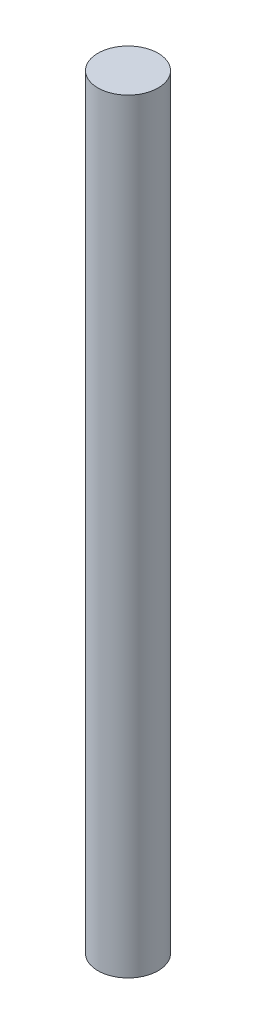
ISO-10303-21;
HEADER;
FILE_DESCRIPTION(('STEP AP214'),'2;1');
FILE_NAME('part.step','',(''),(''),'','','');
FILE_SCHEMA(('AUTOMOTIVE_DESIGN { 1 0 10303 214 1 1 1 1 }'));
ENDSEC;
DATA;
#1=APPLICATION_CONTEXT('core data for automotive mechanical design processes');
#2=APPLICATION_PROTOCOL_DEFINITION('international standard','automotive_design',2000,#1);
#3=PRODUCT_CONTEXT('',#1,'mechanical');
#4=PRODUCT('Part','Part','',(#3));
#5=PRODUCT_RELATED_PRODUCT_CATEGORY('part','',(#4));
#6=PRODUCT_DEFINITION_FORMATION('','',#4);
#7=PRODUCT_DEFINITION_CONTEXT('part definition',#1,'design');
#8=PRODUCT_DEFINITION('design','',#6,#7);
#9=PRODUCT_DEFINITION_SHAPE('','',#8);
#10=(LENGTH_UNIT() NAMED_UNIT(*) SI_UNIT(.MILLI.,.METRE.));
#11=(NAMED_UNIT(*) PLANE_ANGLE_UNIT() SI_UNIT($,.RADIAN.));
#12=(NAMED_UNIT(*) SI_UNIT($,.STERADIAN.) SOLID_ANGLE_UNIT());
#13=UNCERTAINTY_MEASURE_WITH_UNIT(LENGTH_MEASURE(1.E-05),#10,'distance_accuracy_value','');
#14=(GEOMETRIC_REPRESENTATION_CONTEXT(3) GLOBAL_UNCERTAINTY_ASSIGNED_CONTEXT((#13)) GLOBAL_UNIT_ASSIGNED_CONTEXT((#10,
#11,#12)) REPRESENTATION_CONTEXT('',''));
#15=CARTESIAN_POINT('',(0.,0.,0.));
#16=DIRECTION('',(0.,0.,1.));
#17=DIRECTION('',(1.,0.,0.));
#18=AXIS2_PLACEMENT_3D('',#15,#16,#17);
#19=CARTESIAN_POINT('',(0.,50.8,0.));
#20=DIRECTION('',(0.,-1.,0.));
#21=DIRECTION('',(0.,0.,-1.));
#22=AXIS2_PLACEMENT_3D('',#19,#20,#21);
#23=CYLINDRICAL_SURFACE('',#22,1.999996);
#24=CARTESIAN_POINT('',(0.,50.8,0.));
#25=DIRECTION('',(0.,1.,0.));
#26=DIRECTION('',(0.,0.,1.));
#27=AXIS2_PLACEMENT_3D('',#24,#25,#26);
#28=CIRCLE('',#27,1.999996);
#29=CARTESIAN_POINT('',(0.,50.8,-1.999996));
#30=VERTEX_POINT('',#29);
#31=EDGE_CURVE('E10',#30,#30,#28,.T.);
#32=CARTESIAN_POINT('',(0.,0.,0.));
#33=DIRECTION('',(0.,1.,0.));
#34=DIRECTION('',(0.,0.,1.));
#35=AXIS2_PLACEMENT_3D('',#32,#33,#34);
#36=CIRCLE('',#35,1.999996);
#37=CARTESIAN_POINT('',(0.,0.,-1.999996));
#38=VERTEX_POINT('',#37);
#39=EDGE_CURVE('E34',#38,#38,#36,.T.);
#40=CARTESIAN_POINT('',(0.,50.8,-1.999996));
#41=CARTESIAN_POINT('',(0.,50.2708333333333,-1.999996));
#42=CARTESIAN_POINT('',(0.,49.7416666666667,-1.999996));
#43=CARTESIAN_POINT('',(0.,48.6833333333333,-1.999996));
#44=CARTESIAN_POINT('',(0.,48.1541666666667,-1.999996));
#45=CARTESIAN_POINT('',(0.,47.0958333333333,-1.999996));
#46=CARTESIAN_POINT('',(0.,46.5666666666667,-1.999996));
#47=CARTESIAN_POINT('',(0.,45.5083333333333,-1.999996));
#48=CARTESIAN_POINT('',(0.,44.9791666666667,-1.999996));
#49=CARTESIAN_POINT('',(0.,43.9208333333333,-1.999996));
#50=CARTESIAN_POINT('',(0.,43.3916666666667,-1.999996));
#51=CARTESIAN_POINT('',(0.,42.3333333333333,-1.999996));
#52=CARTESIAN_POINT('',(0.,41.8041666666667,-1.999996));
#53=CARTESIAN_POINT('',(0.,40.7458333333333,-1.999996));
#54=CARTESIAN_POINT('',(0.,40.2166666666667,-1.999996));
#55=CARTESIAN_POINT('',(0.,39.1583333333333,-1.999996));
#56=CARTESIAN_POINT('',(0.,38.6291666666667,-1.999996));
#57=CARTESIAN_POINT('',(0.,37.5708333333333,-1.999996));
#58=CARTESIAN_POINT('',(0.,37.0416666666667,-1.999996));
#59=CARTESIAN_POINT('',(0.,35.9833333333333,-1.999996));
#60=CARTESIAN_POINT('',(0.,35.4541666666667,-1.999996));
#61=CARTESIAN_POINT('',(0.,34.3958333333333,-1.999996));
#62=CARTESIAN_POINT('',(0.,33.8666666666667,-1.999996));
#63=CARTESIAN_POINT('',(0.,32.8083333333333,-1.999996));
#64=CARTESIAN_POINT('',(0.,32.2791666666667,-1.999996));
#65=CARTESIAN_POINT('',(0.,31.2208333333333,-1.999996));
#66=CARTESIAN_POINT('',(0.,30.6916666666667,-1.999996));
#67=CARTESIAN_POINT('',(0.,29.6333333333333,-1.999996));
#68=CARTESIAN_POINT('',(0.,29.1041666666667,-1.999996));
#69=CARTESIAN_POINT('',(0.,28.0458333333333,-1.999996));
#70=CARTESIAN_POINT('',(0.,27.5166666666667,-1.999996));
#71=CARTESIAN_POINT('',(0.,26.4583333333333,-1.999996));
#72=CARTESIAN_POINT('',(0.,25.9291666666667,-1.999996));
#73=CARTESIAN_POINT('',(0.,24.8708333333333,-1.999996));
#74=CARTESIAN_POINT('',(0.,24.3416666666667,-1.999996));
#75=CARTESIAN_POINT('',(0.,23.2833333333333,-1.999996));
#76=CARTESIAN_POINT('',(0.,22.7541666666667,-1.999996));
#77=CARTESIAN_POINT('',(0.,21.6958333333333,-1.999996));
#78=CARTESIAN_POINT('',(0.,21.1666666666667,-1.999996));
#79=CARTESIAN_POINT('',(0.,20.1083333333333,-1.999996));
#80=CARTESIAN_POINT('',(0.,19.5791666666667,-1.999996));
#81=CARTESIAN_POINT('',(0.,18.5208333333333,-1.999996));
#82=CARTESIAN_POINT('',(0.,17.9916666666667,-1.999996));
#83=CARTESIAN_POINT('',(0.,16.9333333333333,-1.999996));
#84=CARTESIAN_POINT('',(0.,16.4041666666667,-1.999996));
#85=CARTESIAN_POINT('',(0.,15.3458333333333,-1.999996));
#86=CARTESIAN_POINT('',(0.,14.8166666666667,-1.999996));
#87=CARTESIAN_POINT('',(0.,13.7583333333333,-1.999996));
#88=CARTESIAN_POINT('',(0.,13.2291666666667,-1.999996));
#89=CARTESIAN_POINT('',(0.,12.1708333333333,-1.999996));
#90=CARTESIAN_POINT('',(0.,11.6416666666667,-1.999996));
#91=CARTESIAN_POINT('',(0.,10.5833333333333,-1.999996));
#92=CARTESIAN_POINT('',(0.,10.0541666666667,-1.999996));
#93=CARTESIAN_POINT('',(0.,8.99583333333333,-1.999996));
#94=CARTESIAN_POINT('',(0.,8.46666666666667,-1.999996));
#95=CARTESIAN_POINT('',(0.,7.40833333333333,-1.999996));
#96=CARTESIAN_POINT('',(0.,6.87916666666667,-1.999996));
#97=CARTESIAN_POINT('',(0.,5.82083333333333,-1.999996));
#98=CARTESIAN_POINT('',(0.,5.29166666666667,-1.999996));
#99=CARTESIAN_POINT('',(0.,4.23333333333333,-1.999996));
#100=CARTESIAN_POINT('',(0.,3.70416666666667,-1.999996));
#101=CARTESIAN_POINT('',(0.,2.64583333333333,-1.999996));
#102=CARTESIAN_POINT('',(0.,2.11666666666666,-1.999996));
#103=CARTESIAN_POINT('',(0.,1.05833333333333,-1.999996));
#104=CARTESIAN_POINT('',(0.,0.529166666666666,-1.999996));
#105=CARTESIAN_POINT('',(0.,0.,-1.999996));
#106=B_SPLINE_CURVE_WITH_KNOTS('',3,(#40,#41,#42,#43,#44,#45,#46,#47,#48,#49,#50,#51,#52,#53,
#54,#55,#56,#57,#58,#59,#60,#61,#62,#63,#64,#65,#66,#67,#68,#69,#70,#71,#72,#73,#74,#75,#76,#77,
#78,#79,#80,#81,#82,#83,#84,#85,#86,#87,#88,#89,#90,#91,#92,#93,#94,#95,#96,#97,#98,#99,#100,
#101,#102,#103,#104,#105),.UNSPECIFIED.,.F.,.F.,(4,2,2,2,2,2,2,2,2,2,2,2,2,2,2,2,2,2,2,2,2,2,2,
2,2,2,2,2,2,2,2,2,4),(0.,1.5875,3.175,4.7625,6.34999999999999,7.93749999999999,9.52499999999999,
11.1125,12.7,14.2875,15.875,17.4625,19.05,20.6375,22.225,23.8125,25.4,26.9875,28.575,30.1625,
31.75,33.3375,34.925,36.5125,38.1,39.6875,41.275,42.8625,44.45,46.0375,47.625,49.2125,50.8),.UNSPECIFIED.);
#107=EDGE_CURVE('BSEAM31',#30,#38,#106,.T.);
#108=ORIENTED_EDGE('',*,*,#31,.F.);
#109=ORIENTED_EDGE('',*,*,#39,.T.);
#110=ORIENTED_EDGE('',*,*,#107,.T.);
#111=ORIENTED_EDGE('',*,*,#107,.F.);
#112=EDGE_LOOP('',(#108,#110,#109,#111));
#113=FACE_BOUND('',#112,.T.);
#114=ADVANCED_FACE('F31',(#113),#23,.T.);
#115=CARTESIAN_POINT('',(0.,50.8,0.));
#116=DIRECTION('',(0.,1.,0.));
#117=DIRECTION('',(0.,0.,1.));
#118=AXIS2_PLACEMENT_3D('',#115,#116,#117);
#119=PLANE('',#118);
#120=ORIENTED_EDGE('',*,*,#31,.T.);
#121=EDGE_LOOP('',(#120));
#122=FACE_BOUND('',#121,.T.);
#123=ADVANCED_FACE('F46',(#122),#119,.T.);
#124=CARTESIAN_POINT('',(0.,0.,0.));
#125=DIRECTION('',(0.,1.,0.));
#126=DIRECTION('',(0.,0.,1.));
#127=AXIS2_PLACEMENT_3D('',#124,#125,#126);
#128=PLANE('',#127);
#129=ORIENTED_EDGE('',*,*,#39,.F.);
#130=EDGE_LOOP('',(#129));
#131=FACE_BOUND('',#130,.T.);
#132=ADVANCED_FACE('F44',(#131),#128,.F.);
#133=CLOSED_SHELL('',(#114,#123,#132));
#134=MANIFOLD_SOLID_BREP('B2',#133);
#135=ADVANCED_BREP_SHAPE_REPRESENTATION('',(#18,#134),#14);
#136=SHAPE_DEFINITION_REPRESENTATION(#9,#135);
ENDSEC;
END-ISO-10303-21;
